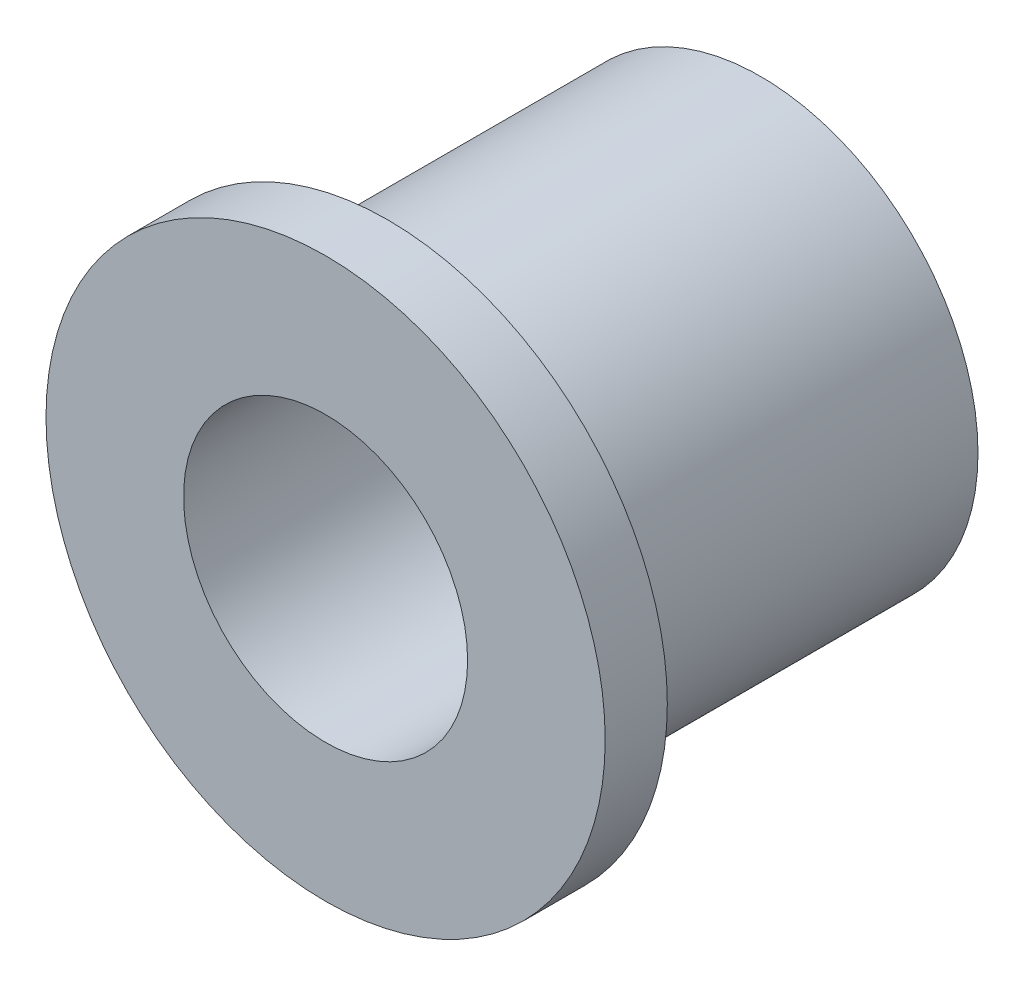
ISO-10303-21;
HEADER;
FILE_DESCRIPTION(('STEP AP214'),'2;1');
FILE_NAME('part.step','',(''),(''),'','','');
FILE_SCHEMA(('AUTOMOTIVE_DESIGN { 1 0 10303 214 1 1 1 1 }'));
ENDSEC;
DATA;
#1=APPLICATION_CONTEXT('core data for automotive mechanical design processes');
#2=APPLICATION_PROTOCOL_DEFINITION('international standard','automotive_design',2000,#1);
#3=PRODUCT_CONTEXT('',#1,'mechanical');
#4=PRODUCT('Part','Part','',(#3));
#5=PRODUCT_RELATED_PRODUCT_CATEGORY('part','',(#4));
#6=PRODUCT_DEFINITION_FORMATION('','',#4);
#7=PRODUCT_DEFINITION_CONTEXT('part definition',#1,'design');
#8=PRODUCT_DEFINITION('design','',#6,#7);
#9=PRODUCT_DEFINITION_SHAPE('','',#8);
#10=(LENGTH_UNIT() NAMED_UNIT(*) SI_UNIT(.MILLI.,.METRE.));
#11=(NAMED_UNIT(*) PLANE_ANGLE_UNIT() SI_UNIT($,.RADIAN.));
#12=(NAMED_UNIT(*) SI_UNIT($,.STERADIAN.) SOLID_ANGLE_UNIT());
#13=UNCERTAINTY_MEASURE_WITH_UNIT(LENGTH_MEASURE(1.E-05),#10,'distance_accuracy_value','');
#14=(GEOMETRIC_REPRESENTATION_CONTEXT(3) GLOBAL_UNCERTAINTY_ASSIGNED_CONTEXT((#13)) GLOBAL_UNIT_ASSIGNED_CONTEXT((#10,
#11,#12)) REPRESENTATION_CONTEXT('',''));
#15=CARTESIAN_POINT('',(0.,0.,0.));
#16=DIRECTION('',(0.,0.,1.));
#17=DIRECTION('',(1.,0.,0.));
#18=AXIS2_PLACEMENT_3D('',#15,#16,#17);
#19=CARTESIAN_POINT('',(0.,0.,0.));
#20=DIRECTION('',(0.,0.,1.));
#21=DIRECTION('',(1.,0.,0.));
#22=AXIS2_PLACEMENT_3D('',#19,#20,#21);
#23=CYLINDRICAL_SURFACE('',#22,3.62857142857143);
#24=CARTESIAN_POINT('',(0.,0.,-11.1125));
#25=DIRECTION('',(0.,0.,1.));
#26=DIRECTION('',(1.,0.,0.));
#27=AXIS2_PLACEMENT_3D('',#24,#25,#26);
#28=CIRCLE('',#27,3.62857142857143);
#29=CARTESIAN_POINT('',(3.62857142857143,0.,-11.1125));
#30=VERTEX_POINT('',#29);
#31=EDGE_CURVE('E52',#30,#30,#28,.T.);
#32=ORIENTED_EDGE('',*,*,#31,.F.);
#33=EDGE_LOOP('',(#32));
#34=FACE_BOUND('',#33,.T.);
#35=CARTESIAN_POINT('',(0.,0.,0.));
#36=DIRECTION('',(0.,0.,1.));
#37=DIRECTION('',(1.,0.,0.));
#38=AXIS2_PLACEMENT_3D('',#35,#36,#37);
#39=CIRCLE('',#38,3.62857142857143);
#40=CARTESIAN_POINT('',(3.62857142857143,0.,0.));
#41=VERTEX_POINT('',#40);
#42=EDGE_CURVE('E10',#41,#41,#39,.T.);
#43=ORIENTED_EDGE('',*,*,#42,.T.);
#44=EDGE_LOOP('',(#43));
#45=FACE_BOUND('',#44,.T.);
#46=ADVANCED_FACE('F30',(#34,#45),#23,.F.);
#47=CARTESIAN_POINT('',(-3.62857142857143,0.,0.));
#48=DIRECTION('',(0.,0.,-1.));
#49=DIRECTION('',(-1.,0.,0.));
#50=AXIS2_PLACEMENT_3D('',#47,#48,#49);
#51=PLANE('',#50);
#52=ORIENTED_EDGE('',*,*,#42,.F.);
#53=EDGE_LOOP('',(#52));
#54=FACE_BOUND('',#53,.T.);
#55=CARTESIAN_POINT('',(0.,0.,0.));
#56=DIRECTION('',(0.,0.,1.));
#57=DIRECTION('',(1.,0.,0.));
#58=AXIS2_PLACEMENT_3D('',#55,#56,#57);
#59=CIRCLE('',#58,7.14375);
#60=CARTESIAN_POINT('',(7.14375,0.,0.));
#61=VERTEX_POINT('',#60);
#62=EDGE_CURVE('E36',#61,#61,#59,.T.);
#63=ORIENTED_EDGE('',*,*,#62,.T.);
#64=EDGE_LOOP('',(#63));
#65=FACE_BOUND('',#64,.T.);
#66=ADVANCED_FACE('F59',(#54,#65),#51,.F.);
#67=CARTESIAN_POINT('',(0.,0.,0.));
#68=DIRECTION('',(0.,0.,1.));
#69=DIRECTION('',(1.,0.,0.));
#70=AXIS2_PLACEMENT_3D('',#67,#68,#69);
#71=CYLINDRICAL_SURFACE('',#70,7.14375);
#72=ORIENTED_EDGE('',*,*,#62,.F.);
#73=EDGE_LOOP('',(#72));
#74=FACE_BOUND('',#73,.T.);
#75=CARTESIAN_POINT('',(0.,0.,-1.5875));
#76=DIRECTION('',(0.,0.,1.));
#77=DIRECTION('',(1.,0.,0.));
#78=AXIS2_PLACEMENT_3D('',#75,#76,#77);
#79=CIRCLE('',#78,7.14375);
#80=CARTESIAN_POINT('',(7.14375,0.,-1.5875));
#81=VERTEX_POINT('',#80);
#82=EDGE_CURVE('E40',#81,#81,#79,.T.);
#83=ORIENTED_EDGE('',*,*,#82,.T.);
#84=EDGE_LOOP('',(#83));
#85=FACE_BOUND('',#84,.T.);
#86=ADVANCED_FACE('F63',(#74,#85),#71,.T.);
#87=CARTESIAN_POINT('',(-7.14375,0.,-1.5875));
#88=DIRECTION('',(0.,0.,1.));
#89=DIRECTION('',(1.,0.,0.));
#90=AXIS2_PLACEMENT_3D('',#87,#88,#89);
#91=PLANE('',#90);
#92=ORIENTED_EDGE('',*,*,#82,.F.);
#93=EDGE_LOOP('',(#92));
#94=FACE_BOUND('',#93,.T.);
#95=CARTESIAN_POINT('',(0.,0.,-1.5875));
#96=DIRECTION('',(0.,0.,1.));
#97=DIRECTION('',(1.,0.,0.));
#98=AXIS2_PLACEMENT_3D('',#95,#96,#97);
#99=CIRCLE('',#98,5.55625);
#100=CARTESIAN_POINT('',(5.55625,0.,-1.5875));
#101=VERTEX_POINT('',#100);
#102=EDGE_CURVE('E44',#101,#101,#99,.T.);
#103=ORIENTED_EDGE('',*,*,#102,.T.);
#104=EDGE_LOOP('',(#103));
#105=FACE_BOUND('',#104,.T.);
#106=ADVANCED_FACE('F68',(#94,#105),#91,.F.);
#107=CARTESIAN_POINT('',(0.,0.,0.));
#108=DIRECTION('',(0.,0.,1.));
#109=DIRECTION('',(1.,0.,0.));
#110=AXIS2_PLACEMENT_3D('',#107,#108,#109);
#111=CYLINDRICAL_SURFACE('',#110,5.55625);
#112=ORIENTED_EDGE('',*,*,#102,.F.);
#113=EDGE_LOOP('',(#112));
#114=FACE_BOUND('',#113,.T.);
#115=CARTESIAN_POINT('',(0.,0.,-11.1125));
#116=DIRECTION('',(0.,0.,1.));
#117=DIRECTION('',(1.,0.,0.));
#118=AXIS2_PLACEMENT_3D('',#115,#116,#117);
#119=CIRCLE('',#118,5.55625);
#120=CARTESIAN_POINT('',(5.55625,0.,-11.1125));
#121=VERTEX_POINT('',#120);
#122=EDGE_CURVE('E49',#121,#121,#119,.T.);
#123=ORIENTED_EDGE('',*,*,#122,.T.);
#124=EDGE_LOOP('',(#123));
#125=FACE_BOUND('',#124,.T.);
#126=ADVANCED_FACE('F74',(#114,#125),#111,.T.);
#127=CARTESIAN_POINT('',(-5.55625,0.,-11.1125));
#128=DIRECTION('',(0.,0.,1.));
#129=DIRECTION('',(1.,0.,0.));
#130=AXIS2_PLACEMENT_3D('',#127,#128,#129);
#131=PLANE('',#130);
#132=ORIENTED_EDGE('',*,*,#122,.F.);
#133=EDGE_LOOP('',(#132));
#134=FACE_BOUND('',#133,.T.);
#135=ORIENTED_EDGE('',*,*,#31,.T.);
#136=EDGE_LOOP('',(#135));
#137=FACE_BOUND('',#136,.T.);
#138=ADVANCED_FACE('F56',(#134,#137),#131,.F.);
#139=CLOSED_SHELL('',(#46,#66,#86,#106,#126,#138));
#140=MANIFOLD_SOLID_BREP('B2',#139);
#141=ADVANCED_BREP_SHAPE_REPRESENTATION('',(#18,#140),#14);
#142=SHAPE_DEFINITION_REPRESENTATION(#9,#141);
ENDSEC;
END-ISO-10303-21;
